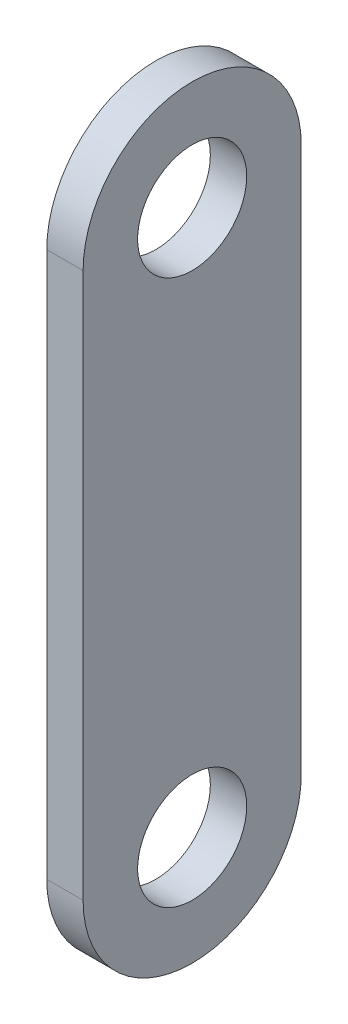
ISO-10303-21;
HEADER;
FILE_DESCRIPTION(('STEP AP214'),'2;1');
FILE_NAME('part.step','',(''),(''),'','','');
FILE_SCHEMA(('AUTOMOTIVE_DESIGN { 1 0 10303 214 1 1 1 1 }'));
ENDSEC;
DATA;
#1=APPLICATION_CONTEXT('core data for automotive mechanical design processes');
#2=APPLICATION_PROTOCOL_DEFINITION('international standard','automotive_design',2000,#1);
#3=PRODUCT_CONTEXT('',#1,'mechanical');
#4=PRODUCT('Part','Part','',(#3));
#5=PRODUCT_RELATED_PRODUCT_CATEGORY('part','',(#4));
#6=PRODUCT_DEFINITION_FORMATION('','',#4);
#7=PRODUCT_DEFINITION_CONTEXT('part definition',#1,'design');
#8=PRODUCT_DEFINITION('design','',#6,#7);
#9=PRODUCT_DEFINITION_SHAPE('','',#8);
#10=(LENGTH_UNIT() NAMED_UNIT(*) SI_UNIT(.MILLI.,.METRE.));
#11=(NAMED_UNIT(*) PLANE_ANGLE_UNIT() SI_UNIT($,.RADIAN.));
#12=(NAMED_UNIT(*) SI_UNIT($,.STERADIAN.) SOLID_ANGLE_UNIT());
#13=UNCERTAINTY_MEASURE_WITH_UNIT(LENGTH_MEASURE(1.E-05),#10,'distance_accuracy_value','');
#14=(GEOMETRIC_REPRESENTATION_CONTEXT(3) GLOBAL_UNCERTAINTY_ASSIGNED_CONTEXT((#13)) GLOBAL_UNIT_ASSIGNED_CONTEXT((#10,
#11,#12)) REPRESENTATION_CONTEXT('',''));
#15=CARTESIAN_POINT('',(0.,0.,0.));
#16=DIRECTION('',(0.,0.,1.));
#17=DIRECTION('',(1.,0.,0.));
#18=AXIS2_PLACEMENT_3D('',#15,#16,#17);
#19=CARTESIAN_POINT('',(10.,0.,0.));
#20=DIRECTION('',(1.,0.,0.));
#21=DIRECTION('',(0.,0.,-1.));
#22=AXIS2_PLACEMENT_3D('',#19,#20,#21);
#23=PLANE('',#22);
#24=CARTESIAN_POINT('',(10.,0.,0.));
#25=DIRECTION('',(1.,0.,0.));
#26=DIRECTION('',(0.,0.,-1.));
#27=AXIS2_PLACEMENT_3D('',#24,#25,#26);
#28=CIRCLE('',#27,15.);
#29=CARTESIAN_POINT('',(10.,0.,-15.));
#30=VERTEX_POINT('',#29);
#31=EDGE_CURVE('E118',#30,#30,#28,.T.);
#32=ORIENTED_EDGE('',*,*,#31,.F.);
#33=EDGE_LOOP('',(#32));
#34=FACE_BOUND('',#33,.T.);
#35=CARTESIAN_POINT('',(10.,0.,0.));
#36=DIRECTION('',(1.,0.,0.));
#37=DIRECTION('',(0.,0.,-1.));
#38=AXIS2_PLACEMENT_3D('',#35,#36,#37);
#39=CIRCLE('',#38,30.);
#40=CARTESIAN_POINT('',(10.,0.,30.));
#41=VERTEX_POINT('',#40);
#42=CARTESIAN_POINT('',(10.,0.,-30.));
#43=VERTEX_POINT('',#42);
#44=EDGE_CURVE('E98',#41,#43,#39,.T.);
#45=ORIENTED_EDGE('',*,*,#44,.T.);
#46=DIRECTION('',(0.,1.,0.));
#47=VECTOR('',#46,1.);
#48=CARTESIAN_POINT('',(10.,0.,-30.));
#49=LINE('',#48,#47);
#50=CARTESIAN_POINT('',(10.,150.,-30.));
#51=VERTEX_POINT('',#50);
#52=EDGE_CURVE('E93',#43,#51,#49,.T.);
#53=ORIENTED_EDGE('',*,*,#52,.T.);
#54=CARTESIAN_POINT('',(10.,150.,0.));
#55=DIRECTION('',(1.,0.,0.));
#56=DIRECTION('',(0.,0.,-1.));
#57=AXIS2_PLACEMENT_3D('',#54,#55,#56);
#58=CIRCLE('',#57,30.);
#59=CARTESIAN_POINT('',(10.,150.,30.));
#60=VERTEX_POINT('',#59);
#61=EDGE_CURVE('E96',#51,#60,#58,.T.);
#62=ORIENTED_EDGE('',*,*,#61,.T.);
#63=DIRECTION('',(0.,-1.,0.));
#64=VECTOR('',#63,1.);
#65=CARTESIAN_POINT('',(10.,0.,30.));
#66=LINE('',#65,#64);
#67=EDGE_CURVE('E63',#60,#41,#66,.T.);
#68=ORIENTED_EDGE('',*,*,#67,.T.);
#69=EDGE_LOOP('',(#45,#53,#62,#68));
#70=FACE_BOUND('',#69,.T.);
#71=CARTESIAN_POINT('',(10.,150.,0.));
#72=DIRECTION('',(1.,0.,0.));
#73=DIRECTION('',(0.,0.,-1.));
#74=AXIS2_PLACEMENT_3D('',#71,#72,#73);
#75=CIRCLE('',#74,15.);
#76=CARTESIAN_POINT('',(10.,150.,-15.));
#77=VERTEX_POINT('',#76);
#78=EDGE_CURVE('E140',#77,#77,#75,.T.);
#79=ORIENTED_EDGE('',*,*,#78,.F.);
#80=EDGE_LOOP('',(#79));
#81=FACE_BOUND('',#80,.T.);
#82=ADVANCED_FACE('F45',(#34,#70,#81),#23,.T.);
#83=CARTESIAN_POINT('',(0.,0.,0.));
#84=DIRECTION('',(1.,0.,0.));
#85=DIRECTION('',(0.,0.,-1.));
#86=AXIS2_PLACEMENT_3D('',#83,#84,#85);
#87=PLANE('',#86);
#88=CARTESIAN_POINT('',(0.,0.,0.));
#89=DIRECTION('',(1.,0.,0.));
#90=DIRECTION('',(0.,0.,-1.));
#91=AXIS2_PLACEMENT_3D('',#88,#89,#90);
#92=CIRCLE('',#91,30.);
#93=CARTESIAN_POINT('',(0.,0.,30.));
#94=VERTEX_POINT('',#93);
#95=CARTESIAN_POINT('',(0.,0.,-30.));
#96=VERTEX_POINT('',#95);
#97=EDGE_CURVE('E114',#94,#96,#92,.T.);
#98=ORIENTED_EDGE('',*,*,#97,.F.);
#99=DIRECTION('',(0.,-1.,0.));
#100=VECTOR('',#99,1.);
#101=CARTESIAN_POINT('',(0.,0.,30.));
#102=LINE('',#101,#100);
#103=CARTESIAN_POINT('',(0.,150.,30.));
#104=VERTEX_POINT('',#103);
#105=EDGE_CURVE('E86',#104,#94,#102,.T.);
#106=ORIENTED_EDGE('',*,*,#105,.F.);
#107=CARTESIAN_POINT('',(0.,150.,0.));
#108=DIRECTION('',(1.,0.,0.));
#109=DIRECTION('',(0.,0.,-1.));
#110=AXIS2_PLACEMENT_3D('',#107,#108,#109);
#111=CIRCLE('',#110,30.);
#112=CARTESIAN_POINT('',(0.,150.,-30.));
#113=VERTEX_POINT('',#112);
#114=EDGE_CURVE('E80',#113,#104,#111,.T.);
#115=ORIENTED_EDGE('',*,*,#114,.F.);
#116=DIRECTION('',(0.,1.,0.));
#117=VECTOR('',#116,1.);
#118=CARTESIAN_POINT('',(0.,0.,-30.));
#119=LINE('',#118,#117);
#120=EDGE_CURVE('E103',#96,#113,#119,.T.);
#121=ORIENTED_EDGE('',*,*,#120,.F.);
#122=EDGE_LOOP('',(#98,#106,#115,#121));
#123=FACE_BOUND('',#122,.T.);
#124=CARTESIAN_POINT('',(0.,0.,0.));
#125=DIRECTION('',(1.,0.,0.));
#126=DIRECTION('',(0.,0.,-1.));
#127=AXIS2_PLACEMENT_3D('',#124,#125,#126);
#128=CIRCLE('',#127,15.);
#129=CARTESIAN_POINT('',(0.,0.,-15.));
#130=VERTEX_POINT('',#129);
#131=EDGE_CURVE('E136',#130,#130,#128,.T.);
#132=ORIENTED_EDGE('',*,*,#131,.T.);
#133=EDGE_LOOP('',(#132));
#134=FACE_BOUND('',#133,.T.);
#135=CARTESIAN_POINT('',(0.,150.,0.));
#136=DIRECTION('',(1.,0.,0.));
#137=DIRECTION('',(0.,0.,-1.));
#138=AXIS2_PLACEMENT_3D('',#135,#136,#137);
#139=CIRCLE('',#138,15.);
#140=CARTESIAN_POINT('',(0.,150.,-15.));
#141=VERTEX_POINT('',#140);
#142=EDGE_CURVE('E144',#141,#141,#139,.T.);
#143=ORIENTED_EDGE('',*,*,#142,.T.);
#144=EDGE_LOOP('',(#143));
#145=FACE_BOUND('',#144,.T.);
#146=ADVANCED_FACE('F131',(#123,#134,#145),#87,.F.);
#147=CARTESIAN_POINT('',(10.,0.,0.));
#148=DIRECTION('',(-1.,0.,0.));
#149=DIRECTION('',(0.,0.,1.));
#150=AXIS2_PLACEMENT_3D('',#147,#148,#149);
#151=CYLINDRICAL_SURFACE('',#150,30.);
#152=ORIENTED_EDGE('',*,*,#97,.T.);
#153=DIRECTION('',(-1.,0.,0.));
#154=VECTOR('',#153,1.);
#155=CARTESIAN_POINT('',(10.,0.,-30.));
#156=LINE('',#155,#154);
#157=EDGE_CURVE('E11',#43,#96,#156,.T.);
#158=ORIENTED_EDGE('',*,*,#157,.F.);
#159=ORIENTED_EDGE('',*,*,#44,.F.);
#160=DIRECTION('',(-1.,0.,0.));
#161=VECTOR('',#160,1.);
#162=CARTESIAN_POINT('',(10.,0.,30.));
#163=LINE('',#162,#161);
#164=EDGE_CURVE('E110',#41,#94,#163,.T.);
#165=ORIENTED_EDGE('',*,*,#164,.T.);
#166=EDGE_LOOP('',(#152,#158,#159,#165));
#167=FACE_BOUND('',#166,.T.);
#168=ADVANCED_FACE('F47',(#167),#151,.T.);
#169=CARTESIAN_POINT('',(10.,0.,-30.));
#170=DIRECTION('',(0.,0.,1.));
#171=DIRECTION('',(1.,0.,0.));
#172=AXIS2_PLACEMENT_3D('',#169,#170,#171);
#173=PLANE('',#172);
#174=ORIENTED_EDGE('',*,*,#120,.T.);
#175=DIRECTION('',(-1.,0.,0.));
#176=VECTOR('',#175,1.);
#177=CARTESIAN_POINT('',(10.,150.,-30.));
#178=LINE('',#177,#176);
#179=EDGE_CURVE('E55',#51,#113,#178,.T.);
#180=ORIENTED_EDGE('',*,*,#179,.F.);
#181=ORIENTED_EDGE('',*,*,#52,.F.);
#182=ORIENTED_EDGE('',*,*,#157,.T.);
#183=EDGE_LOOP('',(#174,#180,#181,#182));
#184=FACE_BOUND('',#183,.T.);
#185=ADVANCED_FACE('F102',(#184),#173,.F.);
#186=CARTESIAN_POINT('',(10.,150.,0.));
#187=DIRECTION('',(-1.,0.,0.));
#188=DIRECTION('',(0.,0.,1.));
#189=AXIS2_PLACEMENT_3D('',#186,#187,#188);
#190=CYLINDRICAL_SURFACE('',#189,30.);
#191=ORIENTED_EDGE('',*,*,#114,.T.);
#192=DIRECTION('',(-1.,0.,0.));
#193=VECTOR('',#192,1.);
#194=CARTESIAN_POINT('',(10.,150.,30.));
#195=LINE('',#194,#193);
#196=EDGE_CURVE('E105',#60,#104,#195,.T.);
#197=ORIENTED_EDGE('',*,*,#196,.F.);
#198=ORIENTED_EDGE('',*,*,#61,.F.);
#199=ORIENTED_EDGE('',*,*,#179,.T.);
#200=EDGE_LOOP('',(#191,#197,#198,#199));
#201=FACE_BOUND('',#200,.T.);
#202=ADVANCED_FACE('F106',(#201),#190,.T.);
#203=CARTESIAN_POINT('',(10.,0.,30.));
#204=DIRECTION('',(0.,0.,-1.));
#205=DIRECTION('',(-1.,0.,0.));
#206=AXIS2_PLACEMENT_3D('',#203,#204,#205);
#207=PLANE('',#206);
#208=ORIENTED_EDGE('',*,*,#105,.T.);
#209=ORIENTED_EDGE('',*,*,#164,.F.);
#210=ORIENTED_EDGE('',*,*,#67,.F.);
#211=ORIENTED_EDGE('',*,*,#196,.T.);
#212=EDGE_LOOP('',(#208,#209,#210,#211));
#213=FACE_BOUND('',#212,.T.);
#214=ADVANCED_FACE('F128',(#213),#207,.F.);
#215=CARTESIAN_POINT('',(10.,0.,0.));
#216=DIRECTION('',(-1.,0.,0.));
#217=DIRECTION('',(0.,0.,1.));
#218=AXIS2_PLACEMENT_3D('',#215,#216,#217);
#219=CYLINDRICAL_SURFACE('',#218,15.);
#220=ORIENTED_EDGE('',*,*,#31,.T.);
#221=EDGE_LOOP('',(#220));
#222=FACE_BOUND('',#221,.T.);
#223=ORIENTED_EDGE('',*,*,#131,.F.);
#224=EDGE_LOOP('',(#223));
#225=FACE_BOUND('',#224,.T.);
#226=ADVANCED_FACE('F163',(#222,#225),#219,.F.);
#227=CARTESIAN_POINT('',(10.,150.,0.));
#228=DIRECTION('',(-1.,0.,0.));
#229=DIRECTION('',(0.,0.,1.));
#230=AXIS2_PLACEMENT_3D('',#227,#228,#229);
#231=CYLINDRICAL_SURFACE('',#230,15.);
#232=ORIENTED_EDGE('',*,*,#78,.T.);
#233=EDGE_LOOP('',(#232));
#234=FACE_BOUND('',#233,.T.);
#235=ORIENTED_EDGE('',*,*,#142,.F.);
#236=EDGE_LOOP('',(#235));
#237=FACE_BOUND('',#236,.T.);
#238=ADVANCED_FACE('F152',(#234,#237),#231,.F.);
#239=CLOSED_SHELL('',(#82,#146,#168,#185,#202,#214,#226,#238));
#240=MANIFOLD_SOLID_BREP('B2',#239);
#241=ADVANCED_BREP_SHAPE_REPRESENTATION('',(#18,#240),#14);
#242=SHAPE_DEFINITION_REPRESENTATION(#9,#241);
ENDSEC;
END-ISO-10303-21;
